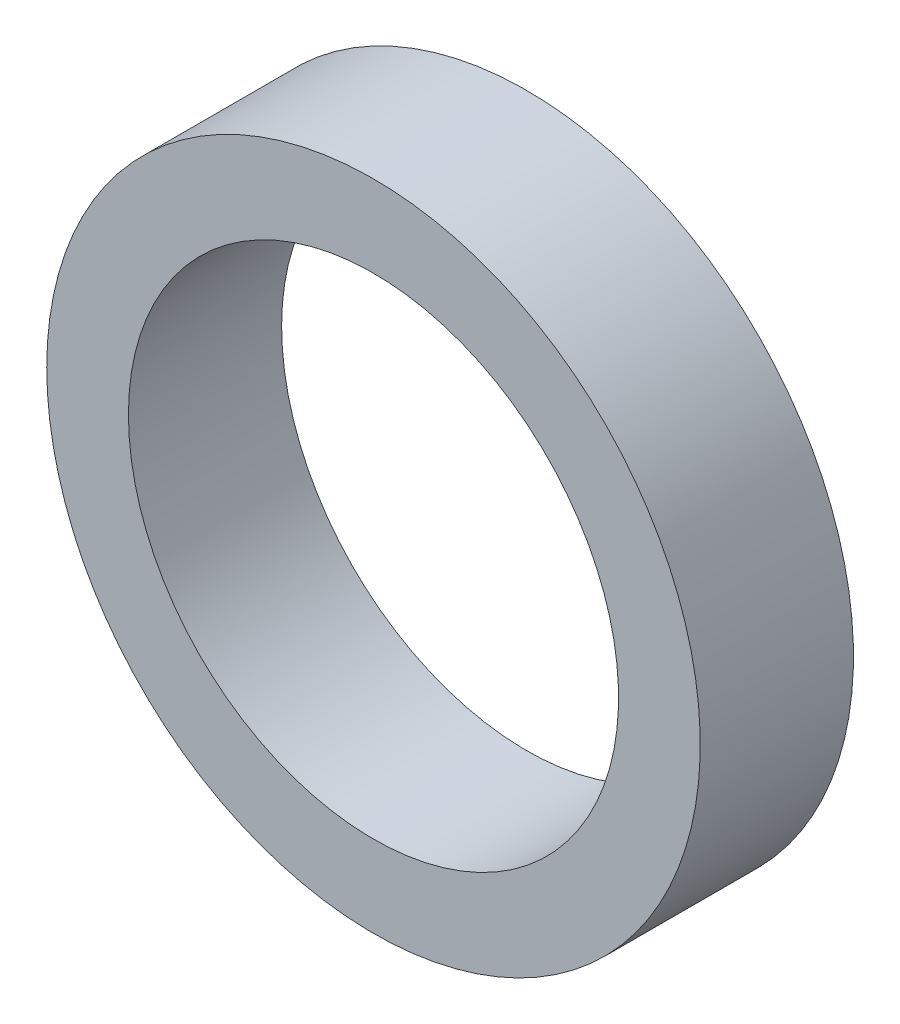
ISO-10303-21;
HEADER;
FILE_DESCRIPTION(('STEP AP214'),'2;1');
FILE_NAME('part.step','',(''),(''),'','','');
FILE_SCHEMA(('AUTOMOTIVE_DESIGN { 1 0 10303 214 1 1 1 1 }'));
ENDSEC;
DATA;
#1=APPLICATION_CONTEXT('core data for automotive mechanical design processes');
#2=APPLICATION_PROTOCOL_DEFINITION('international standard','automotive_design',2000,#1);
#3=PRODUCT_CONTEXT('',#1,'mechanical');
#4=PRODUCT('Part','Part','',(#3));
#5=PRODUCT_RELATED_PRODUCT_CATEGORY('part','',(#4));
#6=PRODUCT_DEFINITION_FORMATION('','',#4);
#7=PRODUCT_DEFINITION_CONTEXT('part definition',#1,'design');
#8=PRODUCT_DEFINITION('design','',#6,#7);
#9=PRODUCT_DEFINITION_SHAPE('','',#8);
#10=(LENGTH_UNIT() NAMED_UNIT(*) SI_UNIT(.MILLI.,.METRE.));
#11=(NAMED_UNIT(*) PLANE_ANGLE_UNIT() SI_UNIT($,.RADIAN.));
#12=(NAMED_UNIT(*) SI_UNIT($,.STERADIAN.) SOLID_ANGLE_UNIT());
#13=UNCERTAINTY_MEASURE_WITH_UNIT(LENGTH_MEASURE(1.E-05),#10,'distance_accuracy_value','');
#14=(GEOMETRIC_REPRESENTATION_CONTEXT(3) GLOBAL_UNCERTAINTY_ASSIGNED_CONTEXT((#13)) GLOBAL_UNIT_ASSIGNED_CONTEXT((#10,
#11,#12)) REPRESENTATION_CONTEXT('',''));
#15=CARTESIAN_POINT('',(0.,0.,0.));
#16=DIRECTION('',(0.,0.,1.));
#17=DIRECTION('',(1.,0.,0.));
#18=AXIS2_PLACEMENT_3D('',#15,#16,#17);
#19=CARTESIAN_POINT('',(0.,0.,4.7625));
#20=DIRECTION('',(0.,0.,1.));
#21=DIRECTION('',(1.,0.,0.));
#22=AXIS2_PLACEMENT_3D('',#19,#20,#21);
#23=PLANE('',#22);
#24=CARTESIAN_POINT('',(0.,0.,4.7625));
#25=DIRECTION('',(0.,0.,1.));
#26=DIRECTION('',(1.,0.,0.));
#27=AXIS2_PLACEMENT_3D('',#24,#25,#26);
#28=CIRCLE('',#27,10.16);
#29=CARTESIAN_POINT('',(-10.16,0.,4.7625));
#30=VERTEX_POINT('',#29);
#31=EDGE_CURVE('E10',#30,#30,#28,.T.);
#32=ORIENTED_EDGE('',*,*,#31,.T.);
#33=EDGE_LOOP('',(#32));
#34=FACE_BOUND('',#33,.T.);
#35=CARTESIAN_POINT('',(0.,0.,4.7625));
#36=DIRECTION('',(0.,0.,1.));
#37=DIRECTION('',(1.,0.,0.));
#38=AXIS2_PLACEMENT_3D('',#35,#36,#37);
#39=CIRCLE('',#38,7.62);
#40=CARTESIAN_POINT('',(-7.62,0.,4.7625));
#41=VERTEX_POINT('',#40);
#42=EDGE_CURVE('E42',#41,#41,#39,.T.);
#43=ORIENTED_EDGE('',*,*,#42,.F.);
#44=EDGE_LOOP('',(#43));
#45=FACE_BOUND('',#44,.T.);
#46=ADVANCED_FACE('F31',(#34,#45),#23,.T.);
#47=CARTESIAN_POINT('',(0.,0.,0.));
#48=DIRECTION('',(0.,0.,1.));
#49=DIRECTION('',(1.,0.,0.));
#50=AXIS2_PLACEMENT_3D('',#47,#48,#49);
#51=PLANE('',#50);
#52=CARTESIAN_POINT('',(0.,0.,0.));
#53=DIRECTION('',(0.,0.,1.));
#54=DIRECTION('',(1.,0.,0.));
#55=AXIS2_PLACEMENT_3D('',#52,#53,#54);
#56=CIRCLE('',#55,10.16);
#57=CARTESIAN_POINT('',(-10.16,0.,0.));
#58=VERTEX_POINT('',#57);
#59=EDGE_CURVE('E35',#58,#58,#56,.T.);
#60=ORIENTED_EDGE('',*,*,#59,.F.);
#61=EDGE_LOOP('',(#60));
#62=FACE_BOUND('',#61,.T.);
#63=CARTESIAN_POINT('',(0.,0.,0.));
#64=DIRECTION('',(0.,0.,1.));
#65=DIRECTION('',(1.,0.,0.));
#66=AXIS2_PLACEMENT_3D('',#63,#64,#65);
#67=CIRCLE('',#66,7.62);
#68=CARTESIAN_POINT('',(-7.62,0.,0.));
#69=VERTEX_POINT('',#68);
#70=EDGE_CURVE('E44',#69,#69,#67,.T.);
#71=ORIENTED_EDGE('',*,*,#70,.T.);
#72=EDGE_LOOP('',(#71));
#73=FACE_BOUND('',#72,.T.);
#74=ADVANCED_FACE('F54',(#62,#73),#51,.F.);
#75=CARTESIAN_POINT('',(0.,0.,4.7625));
#76=DIRECTION('',(0.,0.,-1.));
#77=DIRECTION('',(-1.,0.,0.));
#78=AXIS2_PLACEMENT_3D('',#75,#76,#77);
#79=CYLINDRICAL_SURFACE('',#78,10.16);
#80=CARTESIAN_POINT('',(-10.16,0.,4.7625));
#81=CARTESIAN_POINT('',(-10.16,0.,4.712890625));
#82=CARTESIAN_POINT('',(-10.16,0.,4.66328125));
#83=CARTESIAN_POINT('',(-10.16,0.,4.5640625));
#84=CARTESIAN_POINT('',(-10.16,0.,4.514453125));
#85=CARTESIAN_POINT('',(-10.16,0.,4.415234375));
#86=CARTESIAN_POINT('',(-10.16,0.,4.365625));
#87=CARTESIAN_POINT('',(-10.16,0.,4.26640625));
#88=CARTESIAN_POINT('',(-10.16,0.,4.216796875));
#89=CARTESIAN_POINT('',(-10.16,0.,4.117578125));
#90=CARTESIAN_POINT('',(-10.16,0.,4.06796875));
#91=CARTESIAN_POINT('',(-10.16,0.,3.96875));
#92=CARTESIAN_POINT('',(-10.16,0.,3.919140625));
#93=CARTESIAN_POINT('',(-10.16,0.,3.819921875));
#94=CARTESIAN_POINT('',(-10.16,0.,3.7703125));
#95=CARTESIAN_POINT('',(-10.16,0.,3.67109375));
#96=CARTESIAN_POINT('',(-10.16,0.,3.621484375));
#97=CARTESIAN_POINT('',(-10.16,0.,3.522265625));
#98=CARTESIAN_POINT('',(-10.16,0.,3.47265625));
#99=CARTESIAN_POINT('',(-10.16,0.,3.3734375));
#100=CARTESIAN_POINT('',(-10.16,0.,3.323828125));
#101=CARTESIAN_POINT('',(-10.16,0.,3.224609375));
#102=CARTESIAN_POINT('',(-10.16,0.,3.175));
#103=CARTESIAN_POINT('',(-10.16,0.,3.07578125));
#104=CARTESIAN_POINT('',(-10.16,0.,3.026171875));
#105=CARTESIAN_POINT('',(-10.16,0.,2.926953125));
#106=CARTESIAN_POINT('',(-10.16,0.,2.87734375));
#107=CARTESIAN_POINT('',(-10.16,0.,2.778125));
#108=CARTESIAN_POINT('',(-10.16,0.,2.728515625));
#109=CARTESIAN_POINT('',(-10.16,0.,2.629296875));
#110=CARTESIAN_POINT('',(-10.16,0.,2.5796875));
#111=CARTESIAN_POINT('',(-10.16,0.,2.48046875));
#112=CARTESIAN_POINT('',(-10.16,0.,2.430859375));
#113=CARTESIAN_POINT('',(-10.16,0.,2.331640625));
#114=CARTESIAN_POINT('',(-10.16,0.,2.28203125));
#115=CARTESIAN_POINT('',(-10.16,0.,2.1828125));
#116=CARTESIAN_POINT('',(-10.16,0.,2.133203125));
#117=CARTESIAN_POINT('',(-10.16,0.,2.033984375));
#118=CARTESIAN_POINT('',(-10.16,0.,1.984375));
#119=CARTESIAN_POINT('',(-10.16,0.,1.88515625));
#120=CARTESIAN_POINT('',(-10.16,0.,1.835546875));
#121=CARTESIAN_POINT('',(-10.16,0.,1.736328125));
#122=CARTESIAN_POINT('',(-10.16,0.,1.68671875));
#123=CARTESIAN_POINT('',(-10.16,0.,1.5875));
#124=CARTESIAN_POINT('',(-10.16,0.,1.537890625));
#125=CARTESIAN_POINT('',(-10.16,0.,1.438671875));
#126=CARTESIAN_POINT('',(-10.16,0.,1.3890625));
#127=CARTESIAN_POINT('',(-10.16,0.,1.28984375));
#128=CARTESIAN_POINT('',(-10.16,0.,1.240234375));
#129=CARTESIAN_POINT('',(-10.16,0.,1.141015625));
#130=CARTESIAN_POINT('',(-10.16,0.,1.09140625));
#131=CARTESIAN_POINT('',(-10.16,0.,0.9921875));
#132=CARTESIAN_POINT('',(-10.16,0.,0.942578125));
#133=CARTESIAN_POINT('',(-10.16,0.,0.843359375));
#134=CARTESIAN_POINT('',(-10.16,0.,0.79375));
#135=CARTESIAN_POINT('',(-10.16,0.,0.69453125));
#136=CARTESIAN_POINT('',(-10.16,0.,0.644921875));
#137=CARTESIAN_POINT('',(-10.16,0.,0.545703125));
#138=CARTESIAN_POINT('',(-10.16,0.,0.49609375));
#139=CARTESIAN_POINT('',(-10.16,0.,0.396875));
#140=CARTESIAN_POINT('',(-10.16,0.,0.347265625));
#141=CARTESIAN_POINT('',(-10.16,0.,0.248046875));
#142=CARTESIAN_POINT('',(-10.16,0.,0.1984375));
#143=CARTESIAN_POINT('',(-10.16,0.,0.09921875));
#144=CARTESIAN_POINT('',(-10.16,0.,0.049609375));
#145=CARTESIAN_POINT('',(-10.16,0.,0.));
#146=B_SPLINE_CURVE_WITH_KNOTS('',3,(#80,#81,#82,#83,#84,#85,#86,#87,#88,#89,#90,#91,#92,#93,
#94,#95,#96,#97,#98,#99,#100,#101,#102,#103,#104,#105,#106,#107,#108,#109,#110,#111,#112,#113,
#114,#115,#116,#117,#118,#119,#120,#121,#122,#123,#124,#125,#126,#127,#128,#129,#130,#131,#132,
#133,#134,#135,#136,#137,#138,#139,#140,#141,#142,#143,#144,#145),.UNSPECIFIED.,.F.,.F.,(4,2,2,
2,2,2,2,2,2,2,2,2,2,2,2,2,2,2,2,2,2,2,2,2,2,2,2,2,2,2,2,2,4),(0.,0.148828124999999,
0.297656249999999,0.446484374999999,0.595312499999999,0.744140625,0.89296875,1.041796875,
1.190625,1.339453125,1.48828125,1.637109375,1.7859375,1.934765625,2.08359375,2.232421875,
2.38125,2.530078125,2.67890625,2.827734375,2.9765625,3.125390625,3.27421875,3.423046875,
3.571875,3.720703125,3.86953125,4.018359375,4.1671875,4.316015625,4.46484375,4.613671875,
4.7625),.UNSPECIFIED.);
#147=EDGE_CURVE('BSEAM33',#30,#58,#146,.T.);
#148=ORIENTED_EDGE('',*,*,#31,.F.);
#149=ORIENTED_EDGE('',*,*,#59,.T.);
#150=ORIENTED_EDGE('',*,*,#147,.T.);
#151=ORIENTED_EDGE('',*,*,#147,.F.);
#152=EDGE_LOOP('',(#148,#150,#149,#151));
#153=FACE_BOUND('',#152,.T.);
#154=ADVANCED_FACE('F33',(#153),#79,.T.);
#155=CARTESIAN_POINT('',(0.,0.,4.7625));
#156=DIRECTION('',(0.,0.,-1.));
#157=DIRECTION('',(-1.,0.,0.));
#158=AXIS2_PLACEMENT_3D('',#155,#156,#157);
#159=CYLINDRICAL_SURFACE('',#158,7.62);
#160=CARTESIAN_POINT('',(-7.62,0.,4.7625));
#161=CARTESIAN_POINT('',(-7.62,0.,4.712890625));
#162=CARTESIAN_POINT('',(-7.62,0.,4.66328125));
#163=CARTESIAN_POINT('',(-7.62,0.,4.5640625));
#164=CARTESIAN_POINT('',(-7.62,0.,4.514453125));
#165=CARTESIAN_POINT('',(-7.62,0.,4.415234375));
#166=CARTESIAN_POINT('',(-7.62,0.,4.365625));
#167=CARTESIAN_POINT('',(-7.62,0.,4.26640625));
#168=CARTESIAN_POINT('',(-7.62,0.,4.216796875));
#169=CARTESIAN_POINT('',(-7.62,0.,4.117578125));
#170=CARTESIAN_POINT('',(-7.62,0.,4.06796875));
#171=CARTESIAN_POINT('',(-7.62,0.,3.96875));
#172=CARTESIAN_POINT('',(-7.62,0.,3.919140625));
#173=CARTESIAN_POINT('',(-7.62,0.,3.819921875));
#174=CARTESIAN_POINT('',(-7.62,0.,3.7703125));
#175=CARTESIAN_POINT('',(-7.62,0.,3.67109375));
#176=CARTESIAN_POINT('',(-7.62,0.,3.621484375));
#177=CARTESIAN_POINT('',(-7.62,0.,3.522265625));
#178=CARTESIAN_POINT('',(-7.62,0.,3.47265625));
#179=CARTESIAN_POINT('',(-7.62,0.,3.3734375));
#180=CARTESIAN_POINT('',(-7.62,0.,3.323828125));
#181=CARTESIAN_POINT('',(-7.62,0.,3.224609375));
#182=CARTESIAN_POINT('',(-7.62,0.,3.175));
#183=CARTESIAN_POINT('',(-7.62,0.,3.07578125));
#184=CARTESIAN_POINT('',(-7.62,0.,3.026171875));
#185=CARTESIAN_POINT('',(-7.62,0.,2.926953125));
#186=CARTESIAN_POINT('',(-7.62,0.,2.87734375));
#187=CARTESIAN_POINT('',(-7.62,0.,2.778125));
#188=CARTESIAN_POINT('',(-7.62,0.,2.728515625));
#189=CARTESIAN_POINT('',(-7.62,0.,2.629296875));
#190=CARTESIAN_POINT('',(-7.62,0.,2.5796875));
#191=CARTESIAN_POINT('',(-7.62,0.,2.48046875));
#192=CARTESIAN_POINT('',(-7.62,0.,2.430859375));
#193=CARTESIAN_POINT('',(-7.62,0.,2.331640625));
#194=CARTESIAN_POINT('',(-7.62,0.,2.28203125));
#195=CARTESIAN_POINT('',(-7.62,0.,2.1828125));
#196=CARTESIAN_POINT('',(-7.62,0.,2.133203125));
#197=CARTESIAN_POINT('',(-7.62,0.,2.033984375));
#198=CARTESIAN_POINT('',(-7.62,0.,1.984375));
#199=CARTESIAN_POINT('',(-7.62,0.,1.88515625));
#200=CARTESIAN_POINT('',(-7.62,0.,1.835546875));
#201=CARTESIAN_POINT('',(-7.62,0.,1.736328125));
#202=CARTESIAN_POINT('',(-7.62,0.,1.68671875));
#203=CARTESIAN_POINT('',(-7.62,0.,1.5875));
#204=CARTESIAN_POINT('',(-7.62,0.,1.537890625));
#205=CARTESIAN_POINT('',(-7.62,0.,1.438671875));
#206=CARTESIAN_POINT('',(-7.62,0.,1.3890625));
#207=CARTESIAN_POINT('',(-7.62,0.,1.28984375));
#208=CARTESIAN_POINT('',(-7.62,0.,1.240234375));
#209=CARTESIAN_POINT('',(-7.62,0.,1.141015625));
#210=CARTESIAN_POINT('',(-7.62,0.,1.09140625));
#211=CARTESIAN_POINT('',(-7.62,0.,0.992187499999999));
#212=CARTESIAN_POINT('',(-7.62,0.,0.942578124999999));
#213=CARTESIAN_POINT('',(-7.62,0.,0.843359375));
#214=CARTESIAN_POINT('',(-7.62,0.,0.79375));
#215=CARTESIAN_POINT('',(-7.62,0.,0.69453125));
#216=CARTESIAN_POINT('',(-7.62,0.,0.644921875));
#217=CARTESIAN_POINT('',(-7.62,0.,0.545703125));
#218=CARTESIAN_POINT('',(-7.62,0.,0.49609375));
#219=CARTESIAN_POINT('',(-7.62,0.,0.396875));
#220=CARTESIAN_POINT('',(-7.62,0.,0.347265625));
#221=CARTESIAN_POINT('',(-7.62,0.,0.248046875));
#222=CARTESIAN_POINT('',(-7.62,0.,0.1984375));
#223=CARTESIAN_POINT('',(-7.62,0.,0.09921875));
#224=CARTESIAN_POINT('',(-7.62,0.,0.049609375));
#225=CARTESIAN_POINT('',(-7.62,0.,0.));
#226=B_SPLINE_CURVE_WITH_KNOTS('',3,(#160,#161,#162,#163,#164,#165,#166,#167,#168,#169,#170,
#171,#172,#173,#174,#175,#176,#177,#178,#179,#180,#181,#182,#183,#184,#185,#186,#187,#188,#189,
#190,#191,#192,#193,#194,#195,#196,#197,#198,#199,#200,#201,#202,#203,#204,#205,#206,#207,#208,
#209,#210,#211,#212,#213,#214,#215,#216,#217,#218,#219,#220,#221,#222,#223,#224,#225),
.UNSPECIFIED.,.F.,.F.,(4,2,2,2,2,2,2,2,2,2,2,2,2,2,2,2,2,2,2,2,2,2,2,2,2,2,2,2,2,2,2,2,4),(0.,
0.148828125,0.29765625,0.446484375,0.5953125,0.744140625,0.892968750000001,1.041796875,1.190625,
1.339453125,1.48828125,1.637109375,1.7859375,1.934765625,2.08359375,2.232421875,2.38125,
2.530078125,2.67890625,2.827734375,2.9765625,3.125390625,3.27421875,3.423046875,3.571875,
3.720703125,3.86953125,4.018359375,4.1671875,4.316015625,4.46484375,4.613671875,4.7625),.UNSPECIFIED.);
#227=EDGE_CURVE('BSEAM50',#41,#69,#226,.T.);
#228=ORIENTED_EDGE('',*,*,#42,.T.);
#229=ORIENTED_EDGE('',*,*,#70,.F.);
#230=ORIENTED_EDGE('',*,*,#227,.T.);
#231=ORIENTED_EDGE('',*,*,#227,.F.);
#232=EDGE_LOOP('',(#228,#230,#229,#231));
#233=FACE_BOUND('',#232,.T.);
#234=ADVANCED_FACE('F50',(#233),#159,.F.);
#235=CLOSED_SHELL('',(#46,#74,#154,#234));
#236=MANIFOLD_SOLID_BREP('B2',#235);
#237=ADVANCED_BREP_SHAPE_REPRESENTATION('',(#18,#236),#14);
#238=SHAPE_DEFINITION_REPRESENTATION(#9,#237);
ENDSEC;
END-ISO-10303-21;
